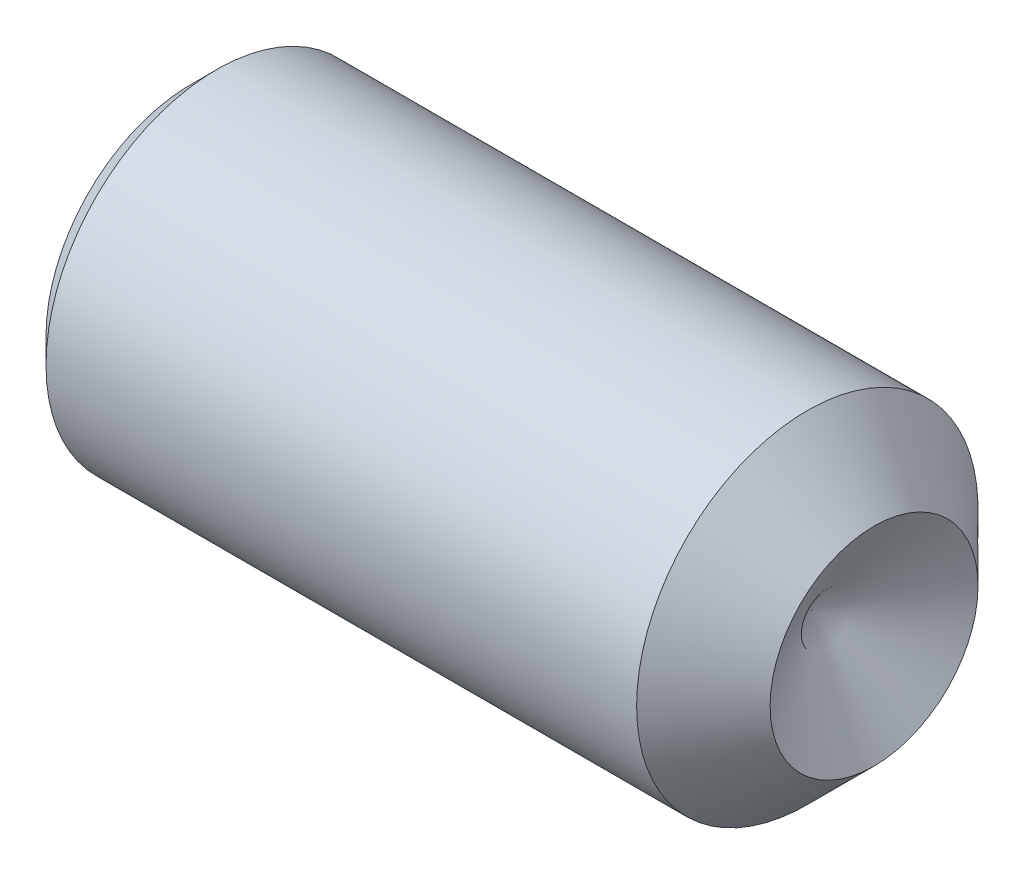
ISO-10303-21;
HEADER;
FILE_DESCRIPTION(('STEP AP214'),'2;1');
FILE_NAME('part.step','',(''),(''),'','','');
FILE_SCHEMA(('AUTOMOTIVE_DESIGN { 1 0 10303 214 1 1 1 1 }'));
ENDSEC;
DATA;
#1=APPLICATION_CONTEXT('core data for automotive mechanical design processes');
#2=APPLICATION_PROTOCOL_DEFINITION('international standard','automotive_design',2000,#1);
#3=PRODUCT_CONTEXT('',#1,'mechanical');
#4=PRODUCT('Part','Part','',(#3));
#5=PRODUCT_RELATED_PRODUCT_CATEGORY('part','',(#4));
#6=PRODUCT_DEFINITION_FORMATION('','',#4);
#7=PRODUCT_DEFINITION_CONTEXT('part definition',#1,'design');
#8=PRODUCT_DEFINITION('design','',#6,#7);
#9=PRODUCT_DEFINITION_SHAPE('','',#8);
#10=(LENGTH_UNIT() NAMED_UNIT(*) SI_UNIT(.MILLI.,.METRE.));
#11=(NAMED_UNIT(*) PLANE_ANGLE_UNIT() SI_UNIT($,.RADIAN.));
#12=(NAMED_UNIT(*) SI_UNIT($,.STERADIAN.) SOLID_ANGLE_UNIT());
#13=UNCERTAINTY_MEASURE_WITH_UNIT(LENGTH_MEASURE(1.E-05),#10,'distance_accuracy_value','');
#14=(GEOMETRIC_REPRESENTATION_CONTEXT(3) GLOBAL_UNCERTAINTY_ASSIGNED_CONTEXT((#13)) GLOBAL_UNIT_ASSIGNED_CONTEXT((#10,
#11,#12)) REPRESENTATION_CONTEXT('',''));
#15=CARTESIAN_POINT('',(0.,0.,0.));
#16=DIRECTION('',(0.,0.,1.));
#17=DIRECTION('',(1.,0.,0.));
#18=AXIS2_PLACEMENT_3D('',#15,#16,#17);
#19=CARTESIAN_POINT('',(0.,0.,0.));
#20=DIRECTION('',(-1.,0.,0.));
#21=DIRECTION('',(0.,0.,1.));
#22=AXIS2_PLACEMENT_3D('',#19,#20,#21);
#23=PLANE('',#22);
#24=CARTESIAN_POINT('',(0.,0.,0.));
#25=DIRECTION('',(-1.,0.,0.));
#26=DIRECTION('',(0.,0.,1.));
#27=AXIS2_PLACEMENT_3D('',#24,#25,#26);
#28=CIRCLE('',#27,10.81024);
#29=CARTESIAN_POINT('',(0.,0.,10.81024));
#30=VERTEX_POINT('',#29);
#31=EDGE_CURVE('E11',#30,#30,#28,.T.);
#32=ORIENTED_EDGE('',*,*,#31,.T.);
#33=EDGE_LOOP('',(#32));
#34=FACE_BOUND('',#33,.T.);
#35=DIRECTION('',(0.,0.,-1.));
#36=VECTOR('',#35,1.);
#37=CARTESIAN_POINT('',(0.,7.1374,4.12077981131403));
#38=LINE('',#37,#36);
#39=CARTESIAN_POINT('',(0.,7.1374,4.12077981131403));
#40=VERTEX_POINT('',#39);
#41=CARTESIAN_POINT('',(0.,7.1374,-4.12077981131404));
#42=VERTEX_POINT('',#41);
#43=EDGE_CURVE('E93',#40,#42,#38,.T.);
#44=ORIENTED_EDGE('',*,*,#43,.F.);
#45=DIRECTION('',(0.,-0.866025403784439,0.5));
#46=VECTOR('',#45,1.);
#47=CARTESIAN_POINT('',(0.,7.1374,4.12077981131403));
#48=LINE('',#47,#46);
#49=CARTESIAN_POINT('',(0.,0.,8.24155962262807));
#50=VERTEX_POINT('',#49);
#51=EDGE_CURVE('E46',#40,#50,#48,.T.);
#52=ORIENTED_EDGE('',*,*,#51,.T.);
#53=DIRECTION('',(0.,0.866025403784439,0.5));
#54=VECTOR('',#53,1.);
#55=CARTESIAN_POINT('',(0.,-7.13739999999999,4.12077981131404));
#56=LINE('',#55,#54);
#57=CARTESIAN_POINT('',(0.,-7.13739999999999,4.12077981131404));
#58=VERTEX_POINT('',#57);
#59=EDGE_CURVE('E99',#58,#50,#56,.T.);
#60=ORIENTED_EDGE('',*,*,#59,.F.);
#61=DIRECTION('',(0.,0.,-1.));
#62=VECTOR('',#61,1.);
#63=CARTESIAN_POINT('',(0.,-7.13739999999999,4.12077981131404));
#64=LINE('',#63,#62);
#65=CARTESIAN_POINT('',(0.,-7.13739999999999,-4.12077981131403));
#66=VERTEX_POINT('',#65);
#67=EDGE_CURVE('E119',#58,#66,#64,.T.);
#68=ORIENTED_EDGE('',*,*,#67,.T.);
#69=DIRECTION('',(0.,0.866025403784438,-0.500000000000001));
#70=VECTOR('',#69,1.);
#71=CARTESIAN_POINT('',(0.,-7.13739999999999,-4.12077981131403));
#72=LINE('',#71,#70);
#73=CARTESIAN_POINT('',(0.,0.,-8.24155962262807));
#74=VERTEX_POINT('',#73);
#75=EDGE_CURVE('E122',#66,#74,#72,.T.);
#76=ORIENTED_EDGE('',*,*,#75,.T.);
#77=DIRECTION('',(0.,-0.866025403784439,-0.5));
#78=VECTOR('',#77,1.);
#79=CARTESIAN_POINT('',(0.,7.1374,-4.12077981131404));
#80=LINE('',#79,#78);
#81=EDGE_CURVE('E125',#42,#74,#80,.T.);
#82=ORIENTED_EDGE('',*,*,#81,.F.);
#83=EDGE_LOOP('',(#44,#52,#60,#68,#76,#82));
#84=FACE_BOUND('',#83,.T.);
#85=ADVANCED_FACE('F32',(#34,#84),#23,.T.);
#86=CARTESIAN_POINT('',(0.,0.,0.));
#87=DIRECTION('',(1.,0.,0.));
#88=DIRECTION('',(0.,0.,-1.));
#89=AXIS2_PLACEMENT_3D('',#86,#87,#88);
#90=CONICAL_SURFACE('',#89,10.81024,0.785398163397449);
#91=CARTESIAN_POINT('',(1.88976,0.,0.));
#92=DIRECTION('',(-1.,0.,0.));
#93=DIRECTION('',(0.,0.,1.));
#94=AXIS2_PLACEMENT_3D('',#91,#92,#93);
#95=CIRCLE('',#94,12.7);
#96=CARTESIAN_POINT('',(1.88976,0.,12.7));
#97=VERTEX_POINT('',#96);
#98=EDGE_CURVE('E39',#97,#97,#95,.T.);
#99=ORIENTED_EDGE('',*,*,#98,.T.);
#100=EDGE_LOOP('',(#99));
#101=FACE_BOUND('',#100,.T.);
#102=ORIENTED_EDGE('',*,*,#31,.F.);
#103=EDGE_LOOP('',(#102));
#104=FACE_BOUND('',#103,.T.);
#105=ADVANCED_FACE('F145',(#101,#104),#90,.T.);
#106=CARTESIAN_POINT('',(-12.7,0.,0.));
#107=DIRECTION('',(-1.,0.,0.));
#108=DIRECTION('',(0.,0.,1.));
#109=AXIS2_PLACEMENT_3D('',#106,#107,#108);
#110=CYLINDRICAL_SURFACE('',#109,12.7);
#111=CARTESIAN_POINT('',(45.8343,0.,0.));
#112=DIRECTION('',(-1.,0.,0.));
#113=DIRECTION('',(0.,0.,1.));
#114=AXIS2_PLACEMENT_3D('',#111,#112,#113);
#115=CIRCLE('',#114,12.7);
#116=CARTESIAN_POINT('',(45.8343,0.,12.7));
#117=VERTEX_POINT('',#116);
#118=EDGE_CURVE('E140',#117,#117,#115,.T.);
#119=ORIENTED_EDGE('',*,*,#118,.T.);
#120=EDGE_LOOP('',(#119));
#121=FACE_BOUND('',#120,.T.);
#122=ORIENTED_EDGE('',*,*,#98,.F.);
#123=EDGE_LOOP('',(#122));
#124=FACE_BOUND('',#123,.T.);
#125=ADVANCED_FACE('F148',(#121,#124),#110,.T.);
#126=CARTESIAN_POINT('',(45.8343,0.,0.));
#127=DIRECTION('',(-1.,0.,0.));
#128=DIRECTION('',(0.,0.,1.));
#129=AXIS2_PLACEMENT_3D('',#126,#127,#128);
#130=CONICAL_SURFACE('',#129,12.7,0.785398163397448);
#131=CARTESIAN_POINT('',(50.8,0.,0.));
#132=DIRECTION('',(-1.,0.,0.));
#133=DIRECTION('',(0.,0.,1.));
#134=AXIS2_PLACEMENT_3D('',#131,#132,#133);
#135=CIRCLE('',#134,7.7343);
#136=CARTESIAN_POINT('',(50.8,0.,7.7343));
#137=VERTEX_POINT('',#136);
#138=EDGE_CURVE('E100',#137,#137,#135,.T.);
#139=ORIENTED_EDGE('',*,*,#138,.T.);
#140=EDGE_LOOP('',(#139));
#141=FACE_BOUND('',#140,.T.);
#142=ORIENTED_EDGE('',*,*,#118,.F.);
#143=EDGE_LOOP('',(#142));
#144=FACE_BOUND('',#143,.T.);
#145=ADVANCED_FACE('F150',(#141,#144),#130,.T.);
#146=CARTESIAN_POINT('',(46.1527637142552,0.,0.));
#147=DIRECTION('',(1.,0.,0.));
#148=DIRECTION('',(0.,0.,-1.));
#149=AXIS2_PLACEMENT_3D('',#146,#147,#148);
#150=CONICAL_SURFACE('',#149,0.,1.02974425867666);
#151=ORIENTED_EDGE('',*,*,#138,.F.);
#152=EDGE_LOOP('',(#151));
#153=FACE_BOUND('',#152,.T.);
#154=CARTESIAN_POINT('',(46.1527637142552,0.,0.));
#155=VERTEX_POINT('',#154);
#156=VERTEX_LOOP('',#155);
#157=FACE_BOUND('',#156,.T.);
#158=ADVANCED_FACE('F157',(#153,#157),#150,.F.);
#159=CARTESIAN_POINT('',(14.2748,7.1374,4.12077981131403));
#160=DIRECTION('',(0.,-0.5,-0.866025403784438));
#161=DIRECTION('',(0.,0.866025403784439,-0.5));
#162=AXIS2_PLACEMENT_3D('',#159,#160,#161);
#163=PLANE('',#162);
#164=ORIENTED_EDGE('',*,*,#51,.F.);
#165=DIRECTION('',(-1.,0.,0.));
#166=VECTOR('',#165,1.);
#167=CARTESIAN_POINT('',(14.2748,7.1374,4.12077981131403));
#168=LINE('',#167,#166);
#169=CARTESIAN_POINT('',(14.2748,7.1374,4.12077981131403));
#170=VERTEX_POINT('',#169);
#171=EDGE_CURVE('E87',#170,#40,#168,.T.);
#172=ORIENTED_EDGE('',*,*,#171,.F.);
#173=DIRECTION('',(0.,-0.866025403784439,0.5));
#174=VECTOR('',#173,1.);
#175=CARTESIAN_POINT('',(14.2748,7.1374,4.12077981131403));
#176=LINE('',#175,#174);
#177=CARTESIAN_POINT('',(14.2748,0.,8.24155962262807));
#178=VERTEX_POINT('',#177);
#179=EDGE_CURVE('E82',#170,#178,#176,.T.);
#180=ORIENTED_EDGE('',*,*,#179,.T.);
#181=DIRECTION('',(-1.,0.,0.));
#182=VECTOR('',#181,1.);
#183=CARTESIAN_POINT('',(14.2748,0.,8.24155962262807));
#184=LINE('',#183,#182);
#185=EDGE_CURVE('E85',#178,#50,#184,.T.);
#186=ORIENTED_EDGE('',*,*,#185,.T.);
#187=EDGE_LOOP('',(#164,#172,#180,#186));
#188=FACE_BOUND('',#187,.T.);
#189=ADVANCED_FACE('F84',(#188),#163,.T.);
#190=CARTESIAN_POINT('',(14.2748,-7.13739999999999,4.12077981131404));
#191=DIRECTION('',(0.,-0.5,0.866025403784439));
#192=DIRECTION('',(0.,-0.866025403784439,-0.5));
#193=AXIS2_PLACEMENT_3D('',#190,#191,#192);
#194=PLANE('',#193);
#195=ORIENTED_EDGE('',*,*,#59,.T.);
#196=ORIENTED_EDGE('',*,*,#185,.F.);
#197=DIRECTION('',(0.,0.866025403784439,0.5));
#198=VECTOR('',#197,1.);
#199=CARTESIAN_POINT('',(14.2748,-7.13739999999999,4.12077981131404));
#200=LINE('',#199,#198);
#201=CARTESIAN_POINT('',(14.2748,-7.13739999999999,4.12077981131404));
#202=VERTEX_POINT('',#201);
#203=EDGE_CURVE('E92',#202,#178,#200,.T.);
#204=ORIENTED_EDGE('',*,*,#203,.F.);
#205=DIRECTION('',(-1.,0.,0.));
#206=VECTOR('',#205,1.);
#207=CARTESIAN_POINT('',(14.2748,-7.13739999999999,4.12077981131404));
#208=LINE('',#207,#206);
#209=EDGE_CURVE('E101',#202,#58,#208,.T.);
#210=ORIENTED_EDGE('',*,*,#209,.T.);
#211=EDGE_LOOP('',(#195,#196,#204,#210));
#212=FACE_BOUND('',#211,.T.);
#213=ADVANCED_FACE('F97',(#212),#194,.F.);
#214=CARTESIAN_POINT('',(14.2748,-7.13739999999999,4.12077981131404));
#215=DIRECTION('',(0.,1.,0.));
#216=DIRECTION('',(0.,0.,1.));
#217=AXIS2_PLACEMENT_3D('',#214,#215,#216);
#218=PLANE('',#217);
#219=ORIENTED_EDGE('',*,*,#67,.F.);
#220=ORIENTED_EDGE('',*,*,#209,.F.);
#221=DIRECTION('',(0.,0.,-1.));
#222=VECTOR('',#221,1.);
#223=CARTESIAN_POINT('',(14.2748,-7.13739999999999,4.12077981131404));
#224=LINE('',#223,#222);
#225=CARTESIAN_POINT('',(14.2748,-7.13739999999999,-4.12077981131403));
#226=VERTEX_POINT('',#225);
#227=EDGE_CURVE('E106',#202,#226,#224,.T.);
#228=ORIENTED_EDGE('',*,*,#227,.T.);
#229=DIRECTION('',(-1.,0.,0.));
#230=VECTOR('',#229,1.);
#231=CARTESIAN_POINT('',(14.2748,-7.13739999999999,-4.12077981131403));
#232=LINE('',#231,#230);
#233=EDGE_CURVE('E135',#226,#66,#232,.T.);
#234=ORIENTED_EDGE('',*,*,#233,.T.);
#235=EDGE_LOOP('',(#219,#220,#228,#234));
#236=FACE_BOUND('',#235,.T.);
#237=ADVANCED_FACE('F180',(#236),#218,.T.);
#238=CARTESIAN_POINT('',(14.2748,-7.13739999999999,-4.12077981131403));
#239=DIRECTION('',(0.,0.500000000000001,0.866025403784438));
#240=DIRECTION('',(0.,-0.866025403784438,0.500000000000001));
#241=AXIS2_PLACEMENT_3D('',#238,#239,#240);
#242=PLANE('',#241);
#243=ORIENTED_EDGE('',*,*,#75,.F.);
#244=ORIENTED_EDGE('',*,*,#233,.F.);
#245=DIRECTION('',(0.,0.866025403784438,-0.500000000000001));
#246=VECTOR('',#245,1.);
#247=CARTESIAN_POINT('',(14.2748,-7.13739999999999,-4.12077981131403));
#248=LINE('',#247,#246);
#249=CARTESIAN_POINT('',(14.2748,0.,-8.24155962262807));
#250=VERTEX_POINT('',#249);
#251=EDGE_CURVE('E108',#226,#250,#248,.T.);
#252=ORIENTED_EDGE('',*,*,#251,.T.);
#253=DIRECTION('',(-1.,0.,0.));
#254=VECTOR('',#253,1.);
#255=CARTESIAN_POINT('',(14.2748,0.,-8.24155962262807));
#256=LINE('',#255,#254);
#257=EDGE_CURVE('E133',#250,#74,#256,.T.);
#258=ORIENTED_EDGE('',*,*,#257,.T.);
#259=EDGE_LOOP('',(#243,#244,#252,#258));
#260=FACE_BOUND('',#259,.T.);
#261=ADVANCED_FACE('F176',(#260),#242,.T.);
#262=CARTESIAN_POINT('',(14.2748,7.1374,-4.12077981131404));
#263=DIRECTION('',(0.,0.5,-0.866025403784439));
#264=DIRECTION('',(0.,0.866025403784439,0.5));
#265=AXIS2_PLACEMENT_3D('',#262,#263,#264);
#266=PLANE('',#265);
#267=ORIENTED_EDGE('',*,*,#81,.T.);
#268=ORIENTED_EDGE('',*,*,#257,.F.);
#269=DIRECTION('',(0.,-0.866025403784439,-0.5));
#270=VECTOR('',#269,1.);
#271=CARTESIAN_POINT('',(14.2748,7.1374,-4.12077981131404));
#272=LINE('',#271,#270);
#273=CARTESIAN_POINT('',(14.2748,7.1374,-4.12077981131404));
#274=VERTEX_POINT('',#273);
#275=EDGE_CURVE('E112',#274,#250,#272,.T.);
#276=ORIENTED_EDGE('',*,*,#275,.F.);
#277=DIRECTION('',(-1.,0.,0.));
#278=VECTOR('',#277,1.);
#279=CARTESIAN_POINT('',(14.2748,7.1374,-4.12077981131404));
#280=LINE('',#279,#278);
#281=EDGE_CURVE('E131',#274,#42,#280,.T.);
#282=ORIENTED_EDGE('',*,*,#281,.T.);
#283=EDGE_LOOP('',(#267,#268,#276,#282));
#284=FACE_BOUND('',#283,.T.);
#285=ADVANCED_FACE('F173',(#284),#266,.F.);
#286=CARTESIAN_POINT('',(14.2748,7.1374,4.12077981131403));
#287=DIRECTION('',(0.,1.,0.));
#288=DIRECTION('',(0.,0.,1.));
#289=AXIS2_PLACEMENT_3D('',#286,#287,#288);
#290=PLANE('',#289);
#291=ORIENTED_EDGE('',*,*,#43,.T.);
#292=ORIENTED_EDGE('',*,*,#281,.F.);
#293=DIRECTION('',(0.,0.,-1.));
#294=VECTOR('',#293,1.);
#295=CARTESIAN_POINT('',(14.2748,7.1374,4.12077981131403));
#296=LINE('',#295,#294);
#297=EDGE_CURVE('E115',#170,#274,#296,.T.);
#298=ORIENTED_EDGE('',*,*,#297,.F.);
#299=ORIENTED_EDGE('',*,*,#171,.T.);
#300=EDGE_LOOP('',(#291,#292,#298,#299));
#301=FACE_BOUND('',#300,.T.);
#302=ADVANCED_FACE('F169',(#301),#290,.F.);
#303=CARTESIAN_POINT('',(14.2748,14.2748,0.));
#304=DIRECTION('',(1.,0.,0.));
#305=DIRECTION('',(0.,0.,-1.));
#306=AXIS2_PLACEMENT_3D('',#303,#304,#305);
#307=PLANE('',#306);
#308=ORIENTED_EDGE('',*,*,#179,.F.);
#309=ORIENTED_EDGE('',*,*,#297,.T.);
#310=ORIENTED_EDGE('',*,*,#275,.T.);
#311=ORIENTED_EDGE('',*,*,#251,.F.);
#312=ORIENTED_EDGE('',*,*,#227,.F.);
#313=ORIENTED_EDGE('',*,*,#203,.T.);
#314=EDGE_LOOP('',(#308,#309,#310,#311,#312,#313));
#315=FACE_BOUND('',#314,.T.);
#316=ADVANCED_FACE('F104',(#315),#307,.F.);
#317=CLOSED_SHELL('',(#85,#105,#125,#145,#158,#189,#213,#237,#261,#285,#302,#316));
#318=MANIFOLD_SOLID_BREP('B2',#317);
#319=ADVANCED_BREP_SHAPE_REPRESENTATION('',(#18,#318),#14);
#320=SHAPE_DEFINITION_REPRESENTATION(#9,#319);
ENDSEC;
END-ISO-10303-21;
